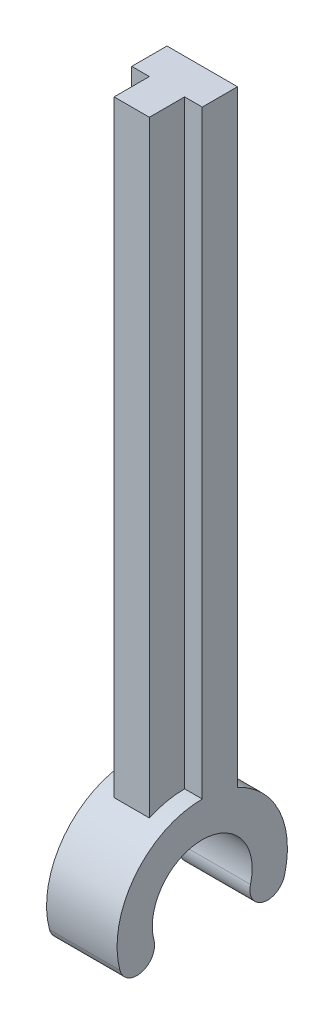
ISO-10303-21;
HEADER;
FILE_DESCRIPTION(('STEP AP214'),'2;1');
FILE_NAME('part.step','',(''),(''),'','','');
FILE_SCHEMA(('AUTOMOTIVE_DESIGN { 1 0 10303 214 1 1 1 1 }'));
ENDSEC;
DATA;
#1=APPLICATION_CONTEXT('core data for automotive mechanical design processes');
#2=APPLICATION_PROTOCOL_DEFINITION('international standard','automotive_design',2000,#1);
#3=PRODUCT_CONTEXT('',#1,'mechanical');
#4=PRODUCT('Part','Part','',(#3));
#5=PRODUCT_RELATED_PRODUCT_CATEGORY('part','',(#4));
#6=PRODUCT_DEFINITION_FORMATION('','',#4);
#7=PRODUCT_DEFINITION_CONTEXT('part definition',#1,'design');
#8=PRODUCT_DEFINITION('design','',#6,#7);
#9=PRODUCT_DEFINITION_SHAPE('','',#8);
#10=(LENGTH_UNIT() NAMED_UNIT(*) SI_UNIT(.MILLI.,.METRE.));
#11=(NAMED_UNIT(*) PLANE_ANGLE_UNIT() SI_UNIT($,.RADIAN.));
#12=(NAMED_UNIT(*) SI_UNIT($,.STERADIAN.) SOLID_ANGLE_UNIT());
#13=UNCERTAINTY_MEASURE_WITH_UNIT(LENGTH_MEASURE(1.E-05),#10,'distance_accuracy_value','');
#14=(GEOMETRIC_REPRESENTATION_CONTEXT(3) GLOBAL_UNCERTAINTY_ASSIGNED_CONTEXT((#13)) GLOBAL_UNIT_ASSIGNED_CONTEXT((#10,
#11,#12)) REPRESENTATION_CONTEXT('',''));
#15=CARTESIAN_POINT('',(0.,0.,0.));
#16=DIRECTION('',(0.,0.,1.));
#17=DIRECTION('',(1.,0.,0.));
#18=AXIS2_PLACEMENT_3D('',#15,#16,#17);
#19=CARTESIAN_POINT('',(-3.,0.,0.));
#20=DIRECTION('',(0.,0.,1.));
#21=DIRECTION('',(0.,-1.,0.));
#22=AXIS2_PLACEMENT_3D('',#19,#20,#21);
#23=PLANE('',#22);
#24=DIRECTION('',(1.,0.,0.));
#25=VECTOR('',#24,1.);
#26=CARTESIAN_POINT('',(-3.,58.25,0.));
#27=LINE('',#26,#25);
#28=CARTESIAN_POINT('',(1.5,58.25,0.));
#29=VERTEX_POINT('',#28);
#30=CARTESIAN_POINT('',(3.,58.25,0.));
#31=VERTEX_POINT('',#30);
#32=EDGE_CURVE('E198',#29,#31,#27,.T.);
#33=ORIENTED_EDGE('',*,*,#32,.F.);
#34=DIRECTION('',(0.,1.,0.));
#35=VECTOR('',#34,1.);
#36=CARTESIAN_POINT('',(1.5,58.25,0.));
#37=LINE('',#36,#35);
#38=CARTESIAN_POINT('',(1.5,7.25000000000001,0.));
#39=VERTEX_POINT('',#38);
#40=EDGE_CURVE('E150',#39,#29,#37,.T.);
#41=ORIENTED_EDGE('',*,*,#40,.F.);
#42=DIRECTION('',(-1.,0.,0.));
#43=VECTOR('',#42,1.);
#44=CARTESIAN_POINT('',(3.,7.25,0.));
#45=LINE('',#44,#43);
#46=CARTESIAN_POINT('',(3.,7.25,0.));
#47=VERTEX_POINT('',#46);
#48=EDGE_CURVE('E206',#47,#39,#45,.T.);
#49=ORIENTED_EDGE('',*,*,#48,.F.);
#50=DIRECTION('',(0.,-1.,0.));
#51=VECTOR('',#50,1.);
#52=CARTESIAN_POINT('',(3.,0.,0.));
#53=LINE('',#52,#51);
#54=EDGE_CURVE('E67',#31,#47,#53,.T.);
#55=ORIENTED_EDGE('',*,*,#54,.F.);
#56=EDGE_LOOP('',(#33,#41,#49,#55));
#57=FACE_BOUND('',#56,.T.);
#58=ADVANCED_FACE('F43',(#57),#23,.T.);
#59=CARTESIAN_POINT('',(3.,0.,0.));
#60=DIRECTION('',(-1.,0.,0.));
#61=DIRECTION('',(0.,0.,1.));
#62=AXIS2_PLACEMENT_3D('',#59,#60,#61);
#63=CYLINDRICAL_SURFACE('',#62,7.25);
#64=DIRECTION('',(-1.,0.,0.));
#65=VECTOR('',#64,1.);
#66=CARTESIAN_POINT('',(3.,6.60018939122205,2.99999999999999));
#67=LINE('',#66,#65);
#68=CARTESIAN_POINT('',(1.5,6.60018939122205,2.99999999999999));
#69=VERTEX_POINT('',#68);
#70=CARTESIAN_POINT('',(-1.5,6.60018939122205,2.99999999999999));
#71=VERTEX_POINT('',#70);
#72=EDGE_CURVE('E11',#69,#71,#67,.T.);
#73=ORIENTED_EDGE('',*,*,#72,.T.);
#74=CARTESIAN_POINT('',(-1.5,0.,0.));
#75=DIRECTION('',(-1.,0.,0.));
#76=DIRECTION('',(0.,0.,1.));
#77=AXIS2_PLACEMENT_3D('',#74,#75,#76);
#78=CIRCLE('',#77,7.25);
#79=CARTESIAN_POINT('',(-1.5,7.25000000000001,0.));
#80=VERTEX_POINT('',#79);
#81=EDGE_CURVE('E169',#71,#80,#78,.T.);
#82=ORIENTED_EDGE('',*,*,#81,.T.);
#83=CARTESIAN_POINT('',(-3.,7.25,0.));
#84=VERTEX_POINT('',#83);
#85=EDGE_CURVE('E205',#80,#84,#45,.T.);
#86=ORIENTED_EDGE('',*,*,#85,.T.);
#87=CARTESIAN_POINT('',(-3.,0.,0.));
#88=DIRECTION('',(1.,0.,0.));
#89=DIRECTION('',(0.,0.,-1.));
#90=AXIS2_PLACEMENT_3D('',#87,#88,#89);
#91=CIRCLE('',#90,7.25);
#92=CARTESIAN_POINT('',(-3.,-1.87643807699328,7.00296224059574));
#93=VERTEX_POINT('',#92);
#94=EDGE_CURVE('E218',#84,#93,#91,.T.);
#95=ORIENTED_EDGE('',*,*,#94,.T.);
#96=DIRECTION('',(-1.,0.,0.));
#97=VECTOR('',#96,1.);
#98=CARTESIAN_POINT('',(3.,-1.87643807699328,7.00296224059574));
#99=LINE('',#98,#97);
#100=CARTESIAN_POINT('',(3.,-1.87643807699328,7.00296224059574));
#101=VERTEX_POINT('',#100);
#102=EDGE_CURVE('E246',#101,#93,#99,.T.);
#103=ORIENTED_EDGE('',*,*,#102,.F.);
#104=CARTESIAN_POINT('',(3.,0.,0.));
#105=DIRECTION('',(1.,0.,0.));
#106=DIRECTION('',(0.,0.,-1.));
#107=AXIS2_PLACEMENT_3D('',#104,#105,#106);
#108=CIRCLE('',#107,7.25);
#109=EDGE_CURVE('E235',#47,#101,#108,.T.);
#110=ORIENTED_EDGE('',*,*,#109,.F.);
#111=ORIENTED_EDGE('',*,*,#48,.T.);
#112=CARTESIAN_POINT('',(1.5,0.,0.));
#113=DIRECTION('',(-1.,0.,0.));
#114=DIRECTION('',(0.,0.,1.));
#115=AXIS2_PLACEMENT_3D('',#112,#113,#114);
#116=CIRCLE('',#115,7.25);
#117=EDGE_CURVE('E141',#69,#39,#116,.T.);
#118=ORIENTED_EDGE('',*,*,#117,.F.);
#119=EDGE_LOOP('',(#73,#82,#86,#95,#103,#110,#111,#118));
#120=FACE_BOUND('',#119,.T.);
#121=ADVANCED_FACE('F287',(#120),#63,.T.);
#122=CARTESIAN_POINT('',(3.,0.,0.));
#123=DIRECTION('',(-1.,0.,0.));
#124=DIRECTION('',(0.,0.,1.));
#125=AXIS2_PLACEMENT_3D('',#122,#123,#124);
#126=CYLINDRICAL_SURFACE('',#125,4.25);
#127=DIRECTION('',(-1.,0.,0.));
#128=VECTOR('',#127,1.);
#129=CARTESIAN_POINT('',(3.,-1.09998094168572,4.10518476172854));
#130=LINE('',#129,#128);
#131=CARTESIAN_POINT('',(3.,-1.09998094168572,4.10518476172854));
#132=VERTEX_POINT('',#131);
#133=CARTESIAN_POINT('',(-3.,-1.09998094168572,4.10518476172854));
#134=VERTEX_POINT('',#133);
#135=EDGE_CURVE('E243',#132,#134,#130,.T.);
#136=ORIENTED_EDGE('',*,*,#135,.T.);
#137=CARTESIAN_POINT('',(-3.,0.,0.));
#138=DIRECTION('',(1.,0.,0.));
#139=DIRECTION('',(0.,0.,-1.));
#140=AXIS2_PLACEMENT_3D('',#137,#138,#139);
#141=CIRCLE('',#140,4.25);
#142=CARTESIAN_POINT('',(-3.,-1.09998094168572,-4.10518476172854));
#143=VERTEX_POINT('',#142);
#144=EDGE_CURVE('E210',#143,#134,#141,.T.);
#145=ORIENTED_EDGE('',*,*,#144,.F.);
#146=DIRECTION('',(-1.,0.,0.));
#147=VECTOR('',#146,1.);
#148=CARTESIAN_POINT('',(3.,-1.09998094168572,-4.10518476172854));
#149=LINE('',#148,#147);
#150=CARTESIAN_POINT('',(3.,-1.09998094168572,-4.10518476172854));
#151=VERTEX_POINT('',#150);
#152=EDGE_CURVE('E52',#151,#143,#149,.T.);
#153=ORIENTED_EDGE('',*,*,#152,.F.);
#154=CARTESIAN_POINT('',(3.,0.,0.));
#155=DIRECTION('',(1.,0.,0.));
#156=DIRECTION('',(0.,0.,-1.));
#157=AXIS2_PLACEMENT_3D('',#154,#155,#156);
#158=CIRCLE('',#157,4.25);
#159=EDGE_CURVE('E227',#151,#132,#158,.T.);
#160=ORIENTED_EDGE('',*,*,#159,.T.);
#161=EDGE_LOOP('',(#136,#145,#153,#160));
#162=FACE_BOUND('',#161,.T.);
#163=ADVANCED_FACE('F45',(#162),#126,.F.);
#164=CARTESIAN_POINT('',(3.,-1.4882095093395,-5.55407350116214));
#165=DIRECTION('',(-1.,0.,0.));
#166=DIRECTION('',(0.,0.,1.));
#167=AXIS2_PLACEMENT_3D('',#164,#165,#166);
#168=CYLINDRICAL_SURFACE('',#167,1.5);
#169=ORIENTED_EDGE('',*,*,#152,.T.);
#170=CARTESIAN_POINT('',(-3.,-1.4882095093395,-5.55407350116214));
#171=DIRECTION('',(1.,0.,0.));
#172=DIRECTION('',(0.,0.,-1.));
#173=AXIS2_PLACEMENT_3D('',#170,#171,#172);
#174=CIRCLE('',#173,1.5);
#175=CARTESIAN_POINT('',(-3.,-1.87643807699328,-7.00296224059574));
#176=VERTEX_POINT('',#175);
#177=EDGE_CURVE('E214',#176,#143,#174,.F.);
#178=ORIENTED_EDGE('',*,*,#177,.F.);
#179=DIRECTION('',(-1.,0.,0.));
#180=VECTOR('',#179,1.);
#181=CARTESIAN_POINT('',(3.,-1.87643807699328,-7.00296224059574));
#182=LINE('',#181,#180);
#183=CARTESIAN_POINT('',(3.,-1.87643807699328,-7.00296224059574));
#184=VERTEX_POINT('',#183);
#185=EDGE_CURVE('E250',#184,#176,#182,.T.);
#186=ORIENTED_EDGE('',*,*,#185,.F.);
#187=CARTESIAN_POINT('',(3.,-1.4882095093395,-5.55407350116214));
#188=DIRECTION('',(1.,0.,0.));
#189=DIRECTION('',(0.,0.,-1.));
#190=AXIS2_PLACEMENT_3D('',#187,#188,#189);
#191=CIRCLE('',#190,1.5);
#192=EDGE_CURVE('E231',#184,#151,#191,.F.);
#193=ORIENTED_EDGE('',*,*,#192,.T.);
#194=EDGE_LOOP('',(#169,#178,#186,#193));
#195=FACE_BOUND('',#194,.T.);
#196=ADVANCED_FACE('F255',(#195),#168,.T.);
#197=CARTESIAN_POINT('',(-3.,6.60018939122204,-3.));
#198=VERTEX_POINT('',#197);
#199=EDGE_CURVE('E219',#176,#198,#91,.T.);
#200=ORIENTED_EDGE('',*,*,#199,.T.);
#201=DIRECTION('',(-1.,0.,0.));
#202=VECTOR('',#201,1.);
#203=CARTESIAN_POINT('',(3.,6.60018939122204,-3.));
#204=LINE('',#203,#202);
#205=CARTESIAN_POINT('',(3.,6.60018939122204,-3.));
#206=VERTEX_POINT('',#205);
#207=EDGE_CURVE('E197',#198,#206,#204,.F.);
#208=ORIENTED_EDGE('',*,*,#207,.T.);
#209=EDGE_CURVE('E236',#184,#206,#108,.T.);
#210=ORIENTED_EDGE('',*,*,#209,.F.);
#211=ORIENTED_EDGE('',*,*,#185,.T.);
#212=EDGE_LOOP('',(#200,#208,#210,#211));
#213=FACE_BOUND('',#212,.T.);
#214=ADVANCED_FACE('F285',(#213),#63,.T.);
#215=CARTESIAN_POINT('',(3.,-1.4882095093395,5.55407350116214));
#216=DIRECTION('',(-1.,0.,0.));
#217=DIRECTION('',(0.,0.,1.));
#218=AXIS2_PLACEMENT_3D('',#215,#216,#217);
#219=CYLINDRICAL_SURFACE('',#218,1.5);
#220=ORIENTED_EDGE('',*,*,#102,.T.);
#221=CARTESIAN_POINT('',(-3.,-1.4882095093395,5.55407350116214));
#222=DIRECTION('',(1.,0.,0.));
#223=DIRECTION('',(0.,0.,-1.));
#224=AXIS2_PLACEMENT_3D('',#221,#222,#223);
#225=CIRCLE('',#224,1.5);
#226=EDGE_CURVE('E223',#93,#134,#225,.T.);
#227=ORIENTED_EDGE('',*,*,#226,.T.);
#228=ORIENTED_EDGE('',*,*,#135,.F.);
#229=CARTESIAN_POINT('',(3.,-1.4882095093395,5.55407350116214));
#230=DIRECTION('',(1.,0.,0.));
#231=DIRECTION('',(0.,0.,-1.));
#232=AXIS2_PLACEMENT_3D('',#229,#230,#231);
#233=CIRCLE('',#232,1.5);
#234=EDGE_CURVE('E240',#101,#132,#233,.T.);
#235=ORIENTED_EDGE('',*,*,#234,.F.);
#236=EDGE_LOOP('',(#220,#227,#228,#235));
#237=FACE_BOUND('',#236,.T.);
#238=ADVANCED_FACE('F269',(#237),#219,.T.);
#239=CARTESIAN_POINT('',(3.,0.,0.));
#240=DIRECTION('',(1.,0.,0.));
#241=DIRECTION('',(0.,0.,-1.));
#242=AXIS2_PLACEMENT_3D('',#239,#240,#241);
#243=PLANE('',#242);
#244=ORIENTED_EDGE('',*,*,#209,.T.);
#245=DIRECTION('',(0.,1.,0.));
#246=VECTOR('',#245,1.);
#247=CARTESIAN_POINT('',(3.,0.,-3.));
#248=LINE('',#247,#246);
#249=CARTESIAN_POINT('',(3.,58.25,-3.));
#250=VERTEX_POINT('',#249);
#251=EDGE_CURVE('E173',#206,#250,#248,.T.);
#252=ORIENTED_EDGE('',*,*,#251,.T.);
#253=DIRECTION('',(0.,0.,-1.));
#254=VECTOR('',#253,1.);
#255=CARTESIAN_POINT('',(3.,58.25,0.));
#256=LINE('',#255,#254);
#257=EDGE_CURVE('E176',#31,#250,#256,.T.);
#258=ORIENTED_EDGE('',*,*,#257,.F.);
#259=ORIENTED_EDGE('',*,*,#54,.T.);
#260=ORIENTED_EDGE('',*,*,#109,.T.);
#261=ORIENTED_EDGE('',*,*,#234,.T.);
#262=ORIENTED_EDGE('',*,*,#159,.F.);
#263=ORIENTED_EDGE('',*,*,#192,.F.);
#264=EDGE_LOOP('',(#244,#252,#258,#259,#260,#261,#262,#263));
#265=FACE_BOUND('',#264,.T.);
#266=ADVANCED_FACE('F279',(#265),#243,.T.);
#267=CARTESIAN_POINT('',(-3.,0.,0.));
#268=DIRECTION('',(1.,0.,0.));
#269=DIRECTION('',(0.,0.,-1.));
#270=AXIS2_PLACEMENT_3D('',#267,#268,#269);
#271=PLANE('',#270);
#272=ORIENTED_EDGE('',*,*,#94,.F.);
#273=DIRECTION('',(0.,-1.,0.));
#274=VECTOR('',#273,1.);
#275=CARTESIAN_POINT('',(-3.,0.,0.));
#276=LINE('',#275,#274);
#277=CARTESIAN_POINT('',(-3.,58.25,0.));
#278=VERTEX_POINT('',#277);
#279=EDGE_CURVE('E189',#278,#84,#276,.T.);
#280=ORIENTED_EDGE('',*,*,#279,.F.);
#281=DIRECTION('',(0.,0.,-1.));
#282=VECTOR('',#281,1.);
#283=CARTESIAN_POINT('',(-3.,58.25,0.));
#284=LINE('',#283,#282);
#285=CARTESIAN_POINT('',(-3.,58.25,-3.));
#286=VERTEX_POINT('',#285);
#287=EDGE_CURVE('E185',#278,#286,#284,.T.);
#288=ORIENTED_EDGE('',*,*,#287,.T.);
#289=DIRECTION('',(0.,1.,0.));
#290=VECTOR('',#289,1.);
#291=CARTESIAN_POINT('',(-3.,0.,-3.));
#292=LINE('',#291,#290);
#293=EDGE_CURVE('E182',#198,#286,#292,.T.);
#294=ORIENTED_EDGE('',*,*,#293,.F.);
#295=ORIENTED_EDGE('',*,*,#199,.F.);
#296=ORIENTED_EDGE('',*,*,#177,.T.);
#297=ORIENTED_EDGE('',*,*,#144,.T.);
#298=ORIENTED_EDGE('',*,*,#226,.F.);
#299=EDGE_LOOP('',(#272,#280,#288,#294,#295,#296,#297,#298));
#300=FACE_BOUND('',#299,.T.);
#301=ADVANCED_FACE('F263',(#300),#271,.F.);
#302=DIRECTION('',(0.,1.,0.));
#303=VECTOR('',#302,1.);
#304=CARTESIAN_POINT('',(-1.5,58.25,0.));
#305=LINE('',#304,#303);
#306=CARTESIAN_POINT('',(-1.5,58.25,0.));
#307=VERTEX_POINT('',#306);
#308=EDGE_CURVE('E156',#80,#307,#305,.T.);
#309=ORIENTED_EDGE('',*,*,#308,.T.);
#310=EDGE_CURVE('E194',#278,#307,#27,.T.);
#311=ORIENTED_EDGE('',*,*,#310,.F.);
#312=ORIENTED_EDGE('',*,*,#279,.T.);
#313=ORIENTED_EDGE('',*,*,#85,.F.);
#314=EDGE_LOOP('',(#309,#311,#312,#313));
#315=FACE_BOUND('',#314,.T.);
#316=ADVANCED_FACE('F295',(#315),#23,.T.);
#317=CARTESIAN_POINT('',(-3.,0.,-3.));
#318=DIRECTION('',(0.,0.,-1.));
#319=DIRECTION('',(-1.,0.,0.));
#320=AXIS2_PLACEMENT_3D('',#317,#318,#319);
#321=PLANE('',#320);
#322=ORIENTED_EDGE('',*,*,#207,.F.);
#323=ORIENTED_EDGE('',*,*,#293,.T.);
#324=DIRECTION('',(1.,0.,0.));
#325=VECTOR('',#324,1.);
#326=CARTESIAN_POINT('',(-3.,58.25,-3.));
#327=LINE('',#326,#325);
#328=EDGE_CURVE('E193',#286,#250,#327,.T.);
#329=ORIENTED_EDGE('',*,*,#328,.T.);
#330=ORIENTED_EDGE('',*,*,#251,.F.);
#331=EDGE_LOOP('',(#322,#323,#329,#330));
#332=FACE_BOUND('',#331,.T.);
#333=ADVANCED_FACE('F282',(#332),#321,.T.);
#334=CARTESIAN_POINT('',(-3.,58.25,0.));
#335=DIRECTION('',(0.,-1.,0.));
#336=DIRECTION('',(0.,0.,-1.));
#337=AXIS2_PLACEMENT_3D('',#334,#335,#336);
#338=PLANE('',#337);
#339=ORIENTED_EDGE('',*,*,#310,.T.);
#340=DIRECTION('',(0.,0.,1.));
#341=VECTOR('',#340,1.);
#342=CARTESIAN_POINT('',(-1.5,58.25,0.));
#343=LINE('',#342,#341);
#344=CARTESIAN_POINT('',(-1.5,58.25,3.));
#345=VERTEX_POINT('',#344);
#346=EDGE_CURVE('E135',#307,#345,#343,.T.);
#347=ORIENTED_EDGE('',*,*,#346,.T.);
#348=DIRECTION('',(1.,0.,0.));
#349=VECTOR('',#348,1.);
#350=CARTESIAN_POINT('',(-1.5,58.25,3.));
#351=LINE('',#350,#349);
#352=CARTESIAN_POINT('',(1.5,58.25,3.));
#353=VERTEX_POINT('',#352);
#354=EDGE_CURVE('E132',#345,#353,#351,.T.);
#355=ORIENTED_EDGE('',*,*,#354,.T.);
#356=DIRECTION('',(0.,0.,1.));
#357=VECTOR('',#356,1.);
#358=CARTESIAN_POINT('',(1.5,58.25,0.));
#359=LINE('',#358,#357);
#360=EDGE_CURVE('E59',#29,#353,#359,.T.);
#361=ORIENTED_EDGE('',*,*,#360,.F.);
#362=ORIENTED_EDGE('',*,*,#32,.T.);
#363=ORIENTED_EDGE('',*,*,#257,.T.);
#364=ORIENTED_EDGE('',*,*,#328,.F.);
#365=ORIENTED_EDGE('',*,*,#287,.F.);
#366=EDGE_LOOP('',(#339,#347,#355,#361,#362,#363,#364,#365));
#367=FACE_BOUND('',#366,.T.);
#368=ADVANCED_FACE('F134',(#367),#338,.F.);
#369=CARTESIAN_POINT('',(-1.5,58.25,3.));
#370=DIRECTION('',(0.,0.,1.));
#371=DIRECTION('',(0.,-1.,0.));
#372=AXIS2_PLACEMENT_3D('',#369,#370,#371);
#373=PLANE('',#372);
#374=ORIENTED_EDGE('',*,*,#72,.F.);
#375=DIRECTION('',(0.,-1.,0.));
#376=VECTOR('',#375,1.);
#377=CARTESIAN_POINT('',(1.5,58.25,3.));
#378=LINE('',#377,#376);
#379=EDGE_CURVE('E147',#353,#69,#378,.T.);
#380=ORIENTED_EDGE('',*,*,#379,.F.);
#381=ORIENTED_EDGE('',*,*,#354,.F.);
#382=DIRECTION('',(0.,-1.,0.));
#383=VECTOR('',#382,1.);
#384=CARTESIAN_POINT('',(-1.5,58.25,3.));
#385=LINE('',#384,#383);
#386=EDGE_CURVE('E142',#345,#71,#385,.T.);
#387=ORIENTED_EDGE('',*,*,#386,.T.);
#388=EDGE_LOOP('',(#374,#380,#381,#387));
#389=FACE_BOUND('',#388,.T.);
#390=ADVANCED_FACE('F154',(#389),#373,.T.);
#391=CARTESIAN_POINT('',(-1.5,0.,0.));
#392=DIRECTION('',(-1.,0.,0.));
#393=DIRECTION('',(0.,0.,1.));
#394=AXIS2_PLACEMENT_3D('',#391,#392,#393);
#395=PLANE('',#394);
#396=ORIENTED_EDGE('',*,*,#81,.F.);
#397=ORIENTED_EDGE('',*,*,#386,.F.);
#398=ORIENTED_EDGE('',*,*,#346,.F.);
#399=ORIENTED_EDGE('',*,*,#308,.F.);
#400=EDGE_LOOP('',(#396,#397,#398,#399));
#401=FACE_BOUND('',#400,.T.);
#402=ADVANCED_FACE('F393',(#401),#395,.T.);
#403=CARTESIAN_POINT('',(1.5,0.,0.));
#404=DIRECTION('',(-1.,0.,0.));
#405=DIRECTION('',(0.,0.,1.));
#406=AXIS2_PLACEMENT_3D('',#403,#404,#405);
#407=PLANE('',#406);
#408=ORIENTED_EDGE('',*,*,#379,.T.);
#409=ORIENTED_EDGE('',*,*,#117,.T.);
#410=ORIENTED_EDGE('',*,*,#40,.T.);
#411=ORIENTED_EDGE('',*,*,#360,.T.);
#412=EDGE_LOOP('',(#408,#409,#410,#411));
#413=FACE_BOUND('',#412,.T.);
#414=ADVANCED_FACE('F146',(#413),#407,.F.);
#415=CLOSED_SHELL('',(#58,#121,#163,#196,#214,#238,#266,#301,#316,#333,#368,#390,#402,#414));
#416=MANIFOLD_SOLID_BREP('B2',#415);
#417=ADVANCED_BREP_SHAPE_REPRESENTATION('',(#18,#416),#14);
#418=SHAPE_DEFINITION_REPRESENTATION(#9,#417);
ENDSEC;
END-ISO-10303-21;
